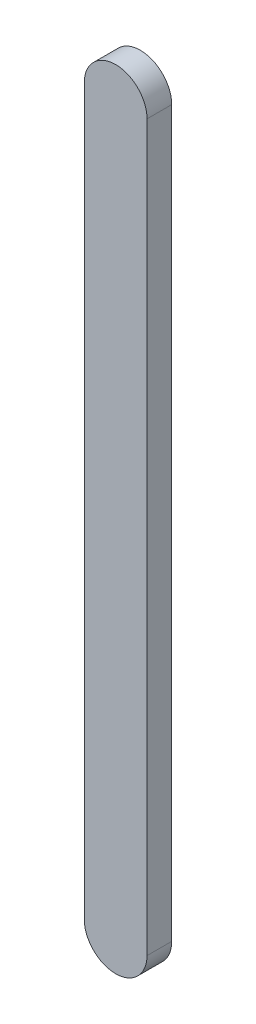
ISO-10303-21;
HEADER;
FILE_DESCRIPTION(('STEP AP214'),'2;1');
FILE_NAME('part.step','',(''),(''),'','','');
FILE_SCHEMA(('AUTOMOTIVE_DESIGN { 1 0 10303 214 1 1 1 1 }'));
ENDSEC;
DATA;
#1=APPLICATION_CONTEXT('core data for automotive mechanical design processes');
#2=APPLICATION_PROTOCOL_DEFINITION('international standard','automotive_design',2000,#1);
#3=PRODUCT_CONTEXT('',#1,'mechanical');
#4=PRODUCT('Part','Part','',(#3));
#5=PRODUCT_RELATED_PRODUCT_CATEGORY('part','',(#4));
#6=PRODUCT_DEFINITION_FORMATION('','',#4);
#7=PRODUCT_DEFINITION_CONTEXT('part definition',#1,'design');
#8=PRODUCT_DEFINITION('design','',#6,#7);
#9=PRODUCT_DEFINITION_SHAPE('','',#8);
#10=(LENGTH_UNIT() NAMED_UNIT(*) SI_UNIT(.MILLI.,.METRE.));
#11=(NAMED_UNIT(*) PLANE_ANGLE_UNIT() SI_UNIT($,.RADIAN.));
#12=(NAMED_UNIT(*) SI_UNIT($,.STERADIAN.) SOLID_ANGLE_UNIT());
#13=UNCERTAINTY_MEASURE_WITH_UNIT(LENGTH_MEASURE(1.E-05),#10,'distance_accuracy_value','');
#14=(GEOMETRIC_REPRESENTATION_CONTEXT(3) GLOBAL_UNCERTAINTY_ASSIGNED_CONTEXT((#13)) GLOBAL_UNIT_ASSIGNED_CONTEXT((#10,
#11,#12)) REPRESENTATION_CONTEXT('',''));
#15=CARTESIAN_POINT('',(0.,0.,0.));
#16=DIRECTION('',(0.,0.,1.));
#17=DIRECTION('',(1.,0.,0.));
#18=AXIS2_PLACEMENT_3D('',#15,#16,#17);
#19=CARTESIAN_POINT('',(133.731,114.173,0.));
#20=DIRECTION('',(-1.,0.,0.));
#21=DIRECTION('',(0.,1.,0.));
#22=AXIS2_PLACEMENT_3D('',#19,#20,#21);
#23=PLANE('',#22);
#24=DIRECTION('',(0.,1.,0.));
#25=VECTOR('',#24,1.);
#26=CARTESIAN_POINT('',(133.731,114.173,0.1999996));
#27=LINE('',#26,#25);
#28=CARTESIAN_POINT('',(133.731,114.173,0.1999996));
#29=VERTEX_POINT('',#28);
#30=CARTESIAN_POINT('',(133.731,120.0404,0.1999996));
#31=VERTEX_POINT('',#30);
#32=EDGE_CURVE('E11',#29,#31,#27,.T.);
#33=ORIENTED_EDGE('',*,*,#32,.F.);
#34=DIRECTION('',(0.,0.,1.));
#35=VECTOR('',#34,1.);
#36=CARTESIAN_POINT('',(133.731,114.173,0.));
#37=LINE('',#36,#35);
#38=CARTESIAN_POINT('',(133.731,114.173,0.));
#39=VERTEX_POINT('',#38);
#40=EDGE_CURVE('E24',#39,#29,#37,.T.);
#41=ORIENTED_EDGE('',*,*,#40,.F.);
#42=DIRECTION('',(0.,1.,0.));
#43=VECTOR('',#42,1.);
#44=CARTESIAN_POINT('',(133.731,114.173,0.));
#45=LINE('',#44,#43);
#46=CARTESIAN_POINT('',(133.731,120.0404,0.));
#47=VERTEX_POINT('',#46);
#48=EDGE_CURVE('E75',#39,#47,#45,.T.);
#49=ORIENTED_EDGE('',*,*,#48,.T.);
#50=DIRECTION('',(0.,0.,1.));
#51=VECTOR('',#50,1.);
#52=CARTESIAN_POINT('',(133.731,120.0404,0.));
#53=LINE('',#52,#51);
#54=EDGE_CURVE('E37',#47,#31,#53,.T.);
#55=ORIENTED_EDGE('',*,*,#54,.T.);
#56=EDGE_LOOP('',(#33,#41,#49,#55));
#57=FACE_BOUND('',#56,.T.);
#58=ADVANCED_FACE('F17',(#57),#23,.F.);
#59=CARTESIAN_POINT('',(133.477,120.0404,0.));
#60=DIRECTION('',(0.,0.,-1.));
#61=DIRECTION('',(1.,0.,0.));
#62=AXIS2_PLACEMENT_3D('',#59,#60,#61);
#63=CYLINDRICAL_SURFACE('',#62,0.253999999999986);
#64=CARTESIAN_POINT('',(133.477,120.0404,0.1999996));
#65=DIRECTION('',(0.,0.,1.));
#66=DIRECTION('',(1.,0.,0.));
#67=AXIS2_PLACEMENT_3D('',#64,#65,#66);
#68=CIRCLE('',#67,0.253999999999986);
#69=CARTESIAN_POINT('',(133.223,120.0404,0.1999996));
#70=VERTEX_POINT('',#69);
#71=EDGE_CURVE('E83',#31,#70,#68,.T.);
#72=ORIENTED_EDGE('',*,*,#71,.F.);
#73=ORIENTED_EDGE('',*,*,#54,.F.);
#74=CARTESIAN_POINT('',(133.477,120.0404,0.));
#75=DIRECTION('',(0.,0.,1.));
#76=DIRECTION('',(1.,0.,0.));
#77=AXIS2_PLACEMENT_3D('',#74,#75,#76);
#78=CIRCLE('',#77,0.253999999999986);
#79=CARTESIAN_POINT('',(133.223,120.0404,0.));
#80=VERTEX_POINT('',#79);
#81=EDGE_CURVE('E81',#47,#80,#78,.T.);
#82=ORIENTED_EDGE('',*,*,#81,.T.);
#83=DIRECTION('',(0.,0.,1.));
#84=VECTOR('',#83,1.);
#85=CARTESIAN_POINT('',(133.223,120.0404,0.));
#86=LINE('',#85,#84);
#87=EDGE_CURVE('E67',#80,#70,#86,.T.);
#88=ORIENTED_EDGE('',*,*,#87,.T.);
#89=EDGE_LOOP('',(#72,#73,#82,#88));
#90=FACE_BOUND('',#89,.T.);
#91=ADVANCED_FACE('F89',(#90),#63,.T.);
#92=CARTESIAN_POINT('',(133.223,120.0404,0.));
#93=DIRECTION('',(1.,0.,0.));
#94=DIRECTION('',(0.,-1.,0.));
#95=AXIS2_PLACEMENT_3D('',#92,#93,#94);
#96=PLANE('',#95);
#97=DIRECTION('',(0.,-1.,0.));
#98=VECTOR('',#97,1.);
#99=CARTESIAN_POINT('',(133.223,120.0404,0.1999996));
#100=LINE('',#99,#98);
#101=CARTESIAN_POINT('',(133.223,114.173,0.1999996));
#102=VERTEX_POINT('',#101);
#103=EDGE_CURVE('E71',#70,#102,#100,.T.);
#104=ORIENTED_EDGE('',*,*,#103,.F.);
#105=ORIENTED_EDGE('',*,*,#87,.F.);
#106=DIRECTION('',(0.,-1.,0.));
#107=VECTOR('',#106,1.);
#108=CARTESIAN_POINT('',(133.223,120.0404,0.));
#109=LINE('',#108,#107);
#110=CARTESIAN_POINT('',(133.223,114.173,0.));
#111=VERTEX_POINT('',#110);
#112=EDGE_CURVE('E63',#80,#111,#109,.T.);
#113=ORIENTED_EDGE('',*,*,#112,.T.);
#114=DIRECTION('',(0.,0.,1.));
#115=VECTOR('',#114,1.);
#116=CARTESIAN_POINT('',(133.223,114.173,0.));
#117=LINE('',#116,#115);
#118=EDGE_CURVE('E53',#111,#102,#117,.T.);
#119=ORIENTED_EDGE('',*,*,#118,.T.);
#120=EDGE_LOOP('',(#104,#105,#113,#119));
#121=FACE_BOUND('',#120,.T.);
#122=ADVANCED_FACE('F66',(#121),#96,.F.);
#123=CARTESIAN_POINT('',(133.477,114.173,0.));
#124=DIRECTION('',(0.,0.,-1.));
#125=DIRECTION('',(-1.,1.11896493820492E-13,0.));
#126=AXIS2_PLACEMENT_3D('',#123,#124,#125);
#127=CYLINDRICAL_SURFACE('',#126,0.253999999999986);
#128=CARTESIAN_POINT('',(133.477,114.173,0.1999996));
#129=DIRECTION('',(0.,0.,1.));
#130=DIRECTION('',(-1.,1.11896493820492E-13,0.));
#131=AXIS2_PLACEMENT_3D('',#128,#129,#130);
#132=CIRCLE('',#131,0.253999999999986);
#133=EDGE_CURVE('E59',#102,#29,#132,.T.);
#134=ORIENTED_EDGE('',*,*,#133,.F.);
#135=ORIENTED_EDGE('',*,*,#118,.F.);
#136=CARTESIAN_POINT('',(133.477,114.173,0.));
#137=DIRECTION('',(0.,0.,1.));
#138=DIRECTION('',(-1.,1.11896493820492E-13,0.));
#139=AXIS2_PLACEMENT_3D('',#136,#137,#138);
#140=CIRCLE('',#139,0.253999999999986);
#141=EDGE_CURVE('E57',#111,#39,#140,.T.);
#142=ORIENTED_EDGE('',*,*,#141,.T.);
#143=ORIENTED_EDGE('',*,*,#40,.T.);
#144=EDGE_LOOP('',(#134,#135,#142,#143));
#145=FACE_BOUND('',#144,.T.);
#146=ADVANCED_FACE('F55',(#145),#127,.T.);
#147=CARTESIAN_POINT('',(133.731,114.173,0.));
#148=DIRECTION('',(0.,0.,-1.));
#149=DIRECTION('',(-1.,0.,0.));
#150=AXIS2_PLACEMENT_3D('',#147,#148,#149);
#151=PLANE('',#150);
#152=ORIENTED_EDGE('',*,*,#141,.F.);
#153=ORIENTED_EDGE('',*,*,#112,.F.);
#154=ORIENTED_EDGE('',*,*,#81,.F.);
#155=ORIENTED_EDGE('',*,*,#48,.F.);
#156=EDGE_LOOP('',(#152,#153,#154,#155));
#157=FACE_BOUND('',#156,.T.);
#158=ADVANCED_FACE('F74',(#157),#151,.T.);
#159=CARTESIAN_POINT('',(133.731,114.173,0.1999996));
#160=DIRECTION('',(0.,0.,-1.));
#161=DIRECTION('',(-1.,0.,0.));
#162=AXIS2_PLACEMENT_3D('',#159,#160,#161);
#163=PLANE('',#162);
#164=ORIENTED_EDGE('',*,*,#32,.T.);
#165=ORIENTED_EDGE('',*,*,#71,.T.);
#166=ORIENTED_EDGE('',*,*,#103,.T.);
#167=ORIENTED_EDGE('',*,*,#133,.T.);
#168=EDGE_LOOP('',(#164,#165,#166,#167));
#169=FACE_BOUND('',#168,.T.);
#170=ADVANCED_FACE('F91',(#169),#163,.F.);
#171=CLOSED_SHELL('',(#58,#91,#122,#146,#158,#170));
#172=MANIFOLD_SOLID_BREP('B1',#171);
#173=ADVANCED_BREP_SHAPE_REPRESENTATION('',(#18,#172),#14);
#174=SHAPE_DEFINITION_REPRESENTATION(#9,#173);
ENDSEC;
END-ISO-10303-21;
